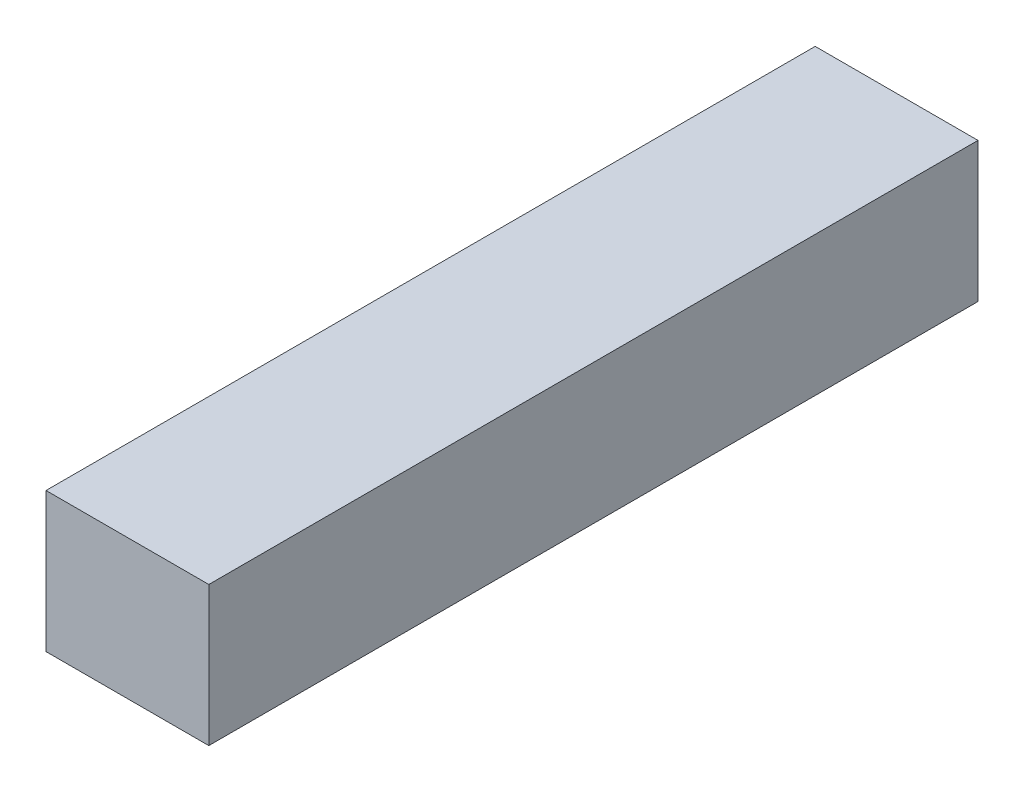
ISO-10303-21;
HEADER;
FILE_DESCRIPTION(('STEP AP214'),'2;1');
FILE_NAME('part.step','',(''),(''),'','','');
FILE_SCHEMA(('AUTOMOTIVE_DESIGN { 1 0 10303 214 1 1 1 1 }'));
ENDSEC;
DATA;
#1=APPLICATION_CONTEXT('core data for automotive mechanical design processes');
#2=APPLICATION_PROTOCOL_DEFINITION('international standard','automotive_design',2000,#1);
#3=PRODUCT_CONTEXT('',#1,'mechanical');
#4=PRODUCT('Part','Part','',(#3));
#5=PRODUCT_RELATED_PRODUCT_CATEGORY('part','',(#4));
#6=PRODUCT_DEFINITION_FORMATION('','',#4);
#7=PRODUCT_DEFINITION_CONTEXT('part definition',#1,'design');
#8=PRODUCT_DEFINITION('design','',#6,#7);
#9=PRODUCT_DEFINITION_SHAPE('','',#8);
#10=(LENGTH_UNIT() NAMED_UNIT(*) SI_UNIT(.MILLI.,.METRE.));
#11=(NAMED_UNIT(*) PLANE_ANGLE_UNIT() SI_UNIT($,.RADIAN.));
#12=(NAMED_UNIT(*) SI_UNIT($,.STERADIAN.) SOLID_ANGLE_UNIT());
#13=UNCERTAINTY_MEASURE_WITH_UNIT(LENGTH_MEASURE(1.E-05),#10,'distance_accuracy_value','');
#14=(GEOMETRIC_REPRESENTATION_CONTEXT(3) GLOBAL_UNCERTAINTY_ASSIGNED_CONTEXT((#13)) GLOBAL_UNIT_ASSIGNED_CONTEXT((#10,
#11,#12)) REPRESENTATION_CONTEXT('',''));
#15=CARTESIAN_POINT('',(0.,0.,0.));
#16=DIRECTION('',(0.,0.,1.));
#17=DIRECTION('',(1.,0.,0.));
#18=AXIS2_PLACEMENT_3D('',#15,#16,#17);
#19=CARTESIAN_POINT('',(0.08890000000001,-0.0762,0.84000086));
#20=DIRECTION('',(0.,0.,1.));
#21=DIRECTION('',(1.,0.,0.));
#22=AXIS2_PLACEMENT_3D('',#19,#20,#21);
#23=PLANE('',#22);
#24=DIRECTION('',(0.,-1.,0.));
#25=VECTOR('',#24,1.);
#26=CARTESIAN_POINT('',(0.08890000000001,0.0762,0.84000086));
#27=LINE('',#26,#25);
#28=CARTESIAN_POINT('',(0.08890000000001,0.0762,0.84000086));
#29=VERTEX_POINT('',#28);
#30=CARTESIAN_POINT('',(0.08890000000001,-0.0762,0.84000086));
#31=VERTEX_POINT('',#30);
#32=EDGE_CURVE('E21',#29,#31,#27,.T.);
#33=ORIENTED_EDGE('',*,*,#32,.F.);
#34=DIRECTION('',(1.,0.,0.));
#35=VECTOR('',#34,1.);
#36=CARTESIAN_POINT('',(-0.0889,0.0762,0.84000086));
#37=LINE('',#36,#35);
#38=CARTESIAN_POINT('',(-0.0889,0.0762,0.84000086));
#39=VERTEX_POINT('',#38);
#40=EDGE_CURVE('E99',#39,#29,#37,.T.);
#41=ORIENTED_EDGE('',*,*,#40,.F.);
#42=DIRECTION('',(0.,1.,0.));
#43=VECTOR('',#42,1.);
#44=CARTESIAN_POINT('',(-0.0889,-0.0762,0.84000086));
#45=LINE('',#44,#43);
#46=CARTESIAN_POINT('',(-0.0889,-0.0762,0.84000086));
#47=VERTEX_POINT('',#46);
#48=EDGE_CURVE('E84',#47,#39,#45,.T.);
#49=ORIENTED_EDGE('',*,*,#48,.F.);
#50=DIRECTION('',(-1.,0.,0.));
#51=VECTOR('',#50,1.);
#52=CARTESIAN_POINT('',(0.08890000000001,-0.0762,0.84000086));
#53=LINE('',#52,#51);
#54=EDGE_CURVE('E88',#31,#47,#53,.T.);
#55=ORIENTED_EDGE('',*,*,#54,.F.);
#56=EDGE_LOOP('',(#33,#41,#49,#55));
#57=FACE_BOUND('',#56,.T.);
#58=ADVANCED_FACE('F17',(#57),#23,.T.);
#59=CARTESIAN_POINT('',(0.08890000000001,-0.0762,0.));
#60=DIRECTION('',(0.,0.,1.));
#61=DIRECTION('',(1.,0.,0.));
#62=AXIS2_PLACEMENT_3D('',#59,#60,#61);
#63=PLANE('',#62);
#64=DIRECTION('',(-1.,0.,0.));
#65=VECTOR('',#64,1.);
#66=CARTESIAN_POINT('',(0.08890000000001,-0.0762,0.));
#67=LINE('',#66,#65);
#68=CARTESIAN_POINT('',(0.08890000000001,-0.0762,0.));
#69=VERTEX_POINT('',#68);
#70=CARTESIAN_POINT('',(-0.0889,-0.0762,0.));
#71=VERTEX_POINT('',#70);
#72=EDGE_CURVE('E72',#69,#71,#67,.T.);
#73=ORIENTED_EDGE('',*,*,#72,.T.);
#74=DIRECTION('',(0.,1.,0.));
#75=VECTOR('',#74,1.);
#76=CARTESIAN_POINT('',(-0.0889,-0.0762,0.));
#77=LINE('',#76,#75);
#78=CARTESIAN_POINT('',(-0.0889,0.0762,0.));
#79=VERTEX_POINT('',#78);
#80=EDGE_CURVE('E97',#71,#79,#77,.T.);
#81=ORIENTED_EDGE('',*,*,#80,.T.);
#82=DIRECTION('',(1.,0.,0.));
#83=VECTOR('',#82,1.);
#84=CARTESIAN_POINT('',(-0.0889,0.0762,0.));
#85=LINE('',#84,#83);
#86=CARTESIAN_POINT('',(0.08890000000001,0.0762,0.));
#87=VERTEX_POINT('',#86);
#88=EDGE_CURVE('E74',#79,#87,#85,.T.);
#89=ORIENTED_EDGE('',*,*,#88,.T.);
#90=DIRECTION('',(0.,-1.,0.));
#91=VECTOR('',#90,1.);
#92=CARTESIAN_POINT('',(0.08890000000001,0.0762,0.));
#93=LINE('',#92,#91);
#94=EDGE_CURVE('E11',#87,#69,#93,.T.);
#95=ORIENTED_EDGE('',*,*,#94,.T.);
#96=EDGE_LOOP('',(#73,#81,#89,#95));
#97=FACE_BOUND('',#96,.T.);
#98=ADVANCED_FACE('F19',(#97),#63,.F.);
#99=CARTESIAN_POINT('',(0.08890000000001,0.0762,0.));
#100=DIRECTION('',(1.,0.,0.));
#101=DIRECTION('',(0.,1.,0.));
#102=AXIS2_PLACEMENT_3D('',#99,#100,#101);
#103=PLANE('',#102);
#104=DIRECTION('',(0.,0.,1.));
#105=VECTOR('',#104,1.);
#106=CARTESIAN_POINT('',(0.08890000000001,0.0762,0.));
#107=LINE('',#106,#105);
#108=EDGE_CURVE('E103',#87,#29,#107,.T.);
#109=ORIENTED_EDGE('',*,*,#108,.T.);
#110=ORIENTED_EDGE('',*,*,#32,.T.);
#111=DIRECTION('',(0.,0.,1.));
#112=VECTOR('',#111,1.);
#113=CARTESIAN_POINT('',(0.08890000000001,-0.0762,0.));
#114=LINE('',#113,#112);
#115=EDGE_CURVE('E80',#69,#31,#114,.T.);
#116=ORIENTED_EDGE('',*,*,#115,.F.);
#117=ORIENTED_EDGE('',*,*,#94,.F.);
#118=EDGE_LOOP('',(#109,#110,#116,#117));
#119=FACE_BOUND('',#118,.T.);
#120=ADVANCED_FACE('F86',(#119),#103,.T.);
#121=CARTESIAN_POINT('',(-0.0889,0.0762,0.));
#122=DIRECTION('',(0.,1.,0.));
#123=DIRECTION('',(1.,0.,0.));
#124=AXIS2_PLACEMENT_3D('',#121,#122,#123);
#125=PLANE('',#124);
#126=DIRECTION('',(0.,0.,1.));
#127=VECTOR('',#126,1.);
#128=CARTESIAN_POINT('',(-0.0889,0.0762,0.));
#129=LINE('',#128,#127);
#130=EDGE_CURVE('E95',#79,#39,#129,.T.);
#131=ORIENTED_EDGE('',*,*,#130,.T.);
#132=ORIENTED_EDGE('',*,*,#40,.T.);
#133=ORIENTED_EDGE('',*,*,#108,.F.);
#134=ORIENTED_EDGE('',*,*,#88,.F.);
#135=EDGE_LOOP('',(#131,#132,#133,#134));
#136=FACE_BOUND('',#135,.T.);
#137=ADVANCED_FACE('F124',(#136),#125,.T.);
#138=CARTESIAN_POINT('',(-0.0889,-0.0762,0.));
#139=DIRECTION('',(-1.,0.,0.));
#140=DIRECTION('',(0.,0.,1.));
#141=AXIS2_PLACEMENT_3D('',#138,#139,#140);
#142=PLANE('',#141);
#143=DIRECTION('',(0.,0.,1.));
#144=VECTOR('',#143,1.);
#145=CARTESIAN_POINT('',(-0.0889,-0.0762,0.));
#146=LINE('',#145,#144);
#147=EDGE_CURVE('E82',#71,#47,#146,.T.);
#148=ORIENTED_EDGE('',*,*,#147,.T.);
#149=ORIENTED_EDGE('',*,*,#48,.T.);
#150=ORIENTED_EDGE('',*,*,#130,.F.);
#151=ORIENTED_EDGE('',*,*,#80,.F.);
#152=EDGE_LOOP('',(#148,#149,#150,#151));
#153=FACE_BOUND('',#152,.T.);
#154=ADVANCED_FACE('F119',(#153),#142,.T.);
#155=CARTESIAN_POINT('',(0.08890000000001,-0.0762,0.));
#156=DIRECTION('',(0.,-1.,0.));
#157=DIRECTION('',(0.,0.,-1.));
#158=AXIS2_PLACEMENT_3D('',#155,#156,#157);
#159=PLANE('',#158);
#160=ORIENTED_EDGE('',*,*,#115,.T.);
#161=ORIENTED_EDGE('',*,*,#54,.T.);
#162=ORIENTED_EDGE('',*,*,#147,.F.);
#163=ORIENTED_EDGE('',*,*,#72,.F.);
#164=EDGE_LOOP('',(#160,#161,#162,#163));
#165=FACE_BOUND('',#164,.T.);
#166=ADVANCED_FACE('F78',(#165),#159,.T.);
#167=CLOSED_SHELL('',(#58,#98,#120,#137,#154,#166));
#168=MANIFOLD_SOLID_BREP('B1',#167);
#169=ADVANCED_BREP_SHAPE_REPRESENTATION('',(#18,#168),#14);
#170=SHAPE_DEFINITION_REPRESENTATION(#9,#169);
ENDSEC;
END-ISO-10303-21;
